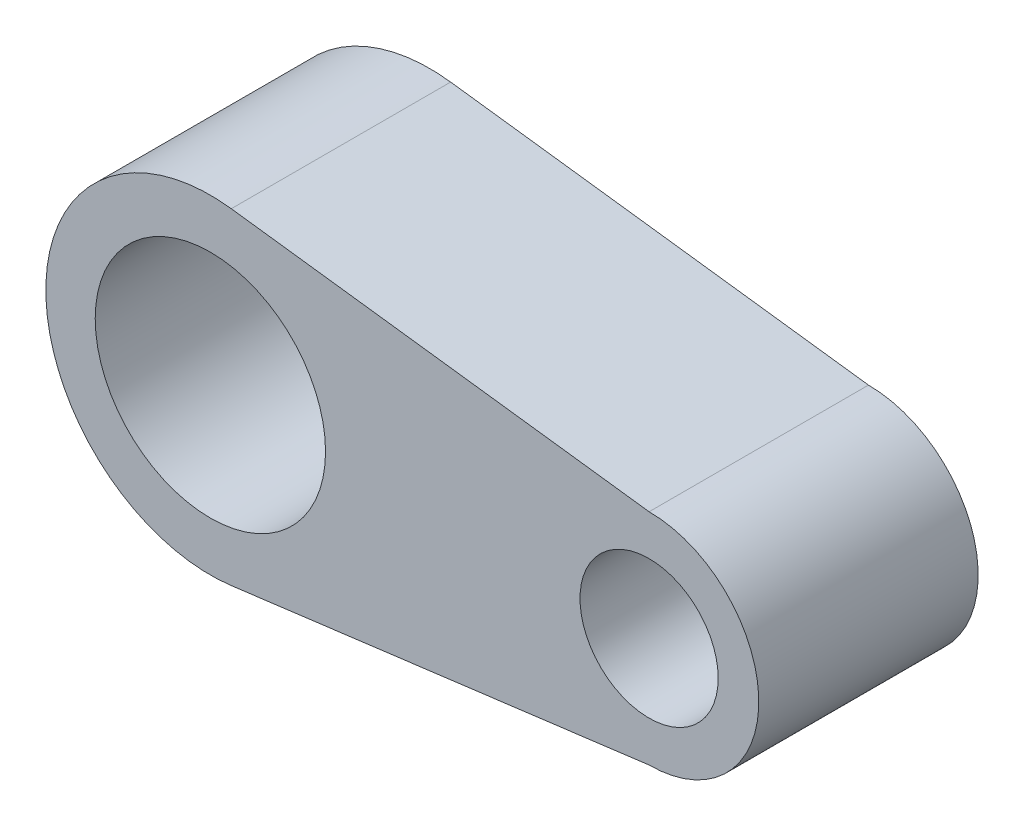
ISO-10303-21;
HEADER;
FILE_DESCRIPTION(('STEP AP214'),'2;1');
FILE_NAME('part.step','',(''),(''),'','','');
FILE_SCHEMA(('AUTOMOTIVE_DESIGN { 1 0 10303 214 1 1 1 1 }'));
ENDSEC;
DATA;
#1=APPLICATION_CONTEXT('core data for automotive mechanical design processes');
#2=APPLICATION_PROTOCOL_DEFINITION('international standard','automotive_design',2000,#1);
#3=PRODUCT_CONTEXT('',#1,'mechanical');
#4=PRODUCT('Part','Part','',(#3));
#5=PRODUCT_RELATED_PRODUCT_CATEGORY('part','',(#4));
#6=PRODUCT_DEFINITION_FORMATION('','',#4);
#7=PRODUCT_DEFINITION_CONTEXT('part definition',#1,'design');
#8=PRODUCT_DEFINITION('design','',#6,#7);
#9=PRODUCT_DEFINITION_SHAPE('','',#8);
#10=(LENGTH_UNIT() NAMED_UNIT(*) SI_UNIT(.MILLI.,.METRE.));
#11=(NAMED_UNIT(*) PLANE_ANGLE_UNIT() SI_UNIT($,.RADIAN.));
#12=(NAMED_UNIT(*) SI_UNIT($,.STERADIAN.) SOLID_ANGLE_UNIT());
#13=UNCERTAINTY_MEASURE_WITH_UNIT(LENGTH_MEASURE(1.E-05),#10,'distance_accuracy_value','');
#14=(GEOMETRIC_REPRESENTATION_CONTEXT(3) GLOBAL_UNCERTAINTY_ASSIGNED_CONTEXT((#13)) GLOBAL_UNIT_ASSIGNED_CONTEXT((#10,
#11,#12)) REPRESENTATION_CONTEXT('',''));
#15=CARTESIAN_POINT('',(0.,0.,0.));
#16=DIRECTION('',(0.,0.,1.));
#17=DIRECTION('',(1.,0.,0.));
#18=AXIS2_PLACEMENT_3D('',#15,#16,#17);
#19=CARTESIAN_POINT('',(0.952688437970163,-7.43924624811937,10.));
#20=DIRECTION('',(0.127025125062688,-0.991899499749248,0.));
#21=DIRECTION('',(0.991899499749248,0.127025125062688,0.));
#22=AXIS2_PLACEMENT_3D('',#19,#20,#21);
#23=PLANE('',#22);
#24=DIRECTION('',(-0.991899499749248,-0.127025125062688,0.));
#25=VECTOR('',#24,1.);
#26=CARTESIAN_POINT('',(0.952688437970163,-7.43924624811937,0.));
#27=LINE('',#26,#25);
#28=CARTESIAN_POINT('',(20.,-5.,0.));
#29=VERTEX_POINT('',#28);
#30=CARTESIAN_POINT('',(0.952688437970161,-7.43924624811936,0.));
#31=VERTEX_POINT('',#30);
#32=EDGE_CURVE('E107',#29,#31,#27,.T.);
#33=ORIENTED_EDGE('',*,*,#32,.F.);
#34=DIRECTION('',(0.,0.,-1.));
#35=VECTOR('',#34,1.);
#36=CARTESIAN_POINT('',(20.,-5.,10.));
#37=LINE('',#36,#35);
#38=CARTESIAN_POINT('',(20.,-5.,10.));
#39=VERTEX_POINT('',#38);
#40=EDGE_CURVE('E11',#39,#29,#37,.T.);
#41=ORIENTED_EDGE('',*,*,#40,.F.);
#42=DIRECTION('',(-0.991899499749248,-0.127025125062688,0.));
#43=VECTOR('',#42,1.);
#44=CARTESIAN_POINT('',(0.952688437970163,-7.43924624811937,10.));
#45=LINE('',#44,#43);
#46=CARTESIAN_POINT('',(0.952688437970161,-7.43924624811936,10.));
#47=VERTEX_POINT('',#46);
#48=EDGE_CURVE('E89',#39,#47,#45,.T.);
#49=ORIENTED_EDGE('',*,*,#48,.T.);
#50=DIRECTION('',(0.,0.,-1.));
#51=VECTOR('',#50,1.);
#52=CARTESIAN_POINT('',(0.952688437970161,-7.43924624811936,10.));
#53=LINE('',#52,#51);
#54=EDGE_CURVE('E77',#47,#31,#53,.T.);
#55=ORIENTED_EDGE('',*,*,#54,.T.);
#56=EDGE_LOOP('',(#33,#41,#49,#55));
#57=FACE_BOUND('',#56,.T.);
#58=ADVANCED_FACE('F38',(#57),#23,.T.);
#59=CARTESIAN_POINT('',(20.,0.,10.));
#60=DIRECTION('',(0.,0.,-1.));
#61=DIRECTION('',(-1.,0.,0.));
#62=AXIS2_PLACEMENT_3D('',#59,#60,#61);
#63=CYLINDRICAL_SURFACE('',#62,5.);
#64=CARTESIAN_POINT('',(20.,0.,0.));
#65=DIRECTION('',(0.,0.,1.));
#66=DIRECTION('',(1.,0.,0.));
#67=AXIS2_PLACEMENT_3D('',#64,#65,#66);
#68=CIRCLE('',#67,5.);
#69=CARTESIAN_POINT('',(20.,5.,0.));
#70=VERTEX_POINT('',#69);
#71=EDGE_CURVE('E94',#29,#70,#68,.T.);
#72=ORIENTED_EDGE('',*,*,#71,.T.);
#73=DIRECTION('',(0.,0.,-1.));
#74=VECTOR('',#73,1.);
#75=CARTESIAN_POINT('',(20.,5.,10.));
#76=LINE('',#75,#74);
#77=CARTESIAN_POINT('',(20.,5.,10.));
#78=VERTEX_POINT('',#77);
#79=EDGE_CURVE('E46',#78,#70,#76,.T.);
#80=ORIENTED_EDGE('',*,*,#79,.F.);
#81=CARTESIAN_POINT('',(20.,0.,10.));
#82=DIRECTION('',(0.,0.,1.));
#83=DIRECTION('',(1.,0.,0.));
#84=AXIS2_PLACEMENT_3D('',#81,#82,#83);
#85=CIRCLE('',#84,5.);
#86=EDGE_CURVE('E83',#39,#78,#85,.T.);
#87=ORIENTED_EDGE('',*,*,#86,.F.);
#88=ORIENTED_EDGE('',*,*,#40,.T.);
#89=EDGE_LOOP('',(#72,#80,#87,#88));
#90=FACE_BOUND('',#89,.T.);
#91=ADVANCED_FACE('F92',(#90),#63,.T.);
#92=CARTESIAN_POINT('',(0.952688437970159,7.43924624811936,10.));
#93=DIRECTION('',(-0.127025125062688,-0.991899499749248,0.));
#94=DIRECTION('',(0.991899499749248,-0.127025125062688,0.));
#95=AXIS2_PLACEMENT_3D('',#92,#93,#94);
#96=PLANE('',#95);
#97=DIRECTION('',(-0.991899499749248,0.127025125062688,0.));
#98=VECTOR('',#97,1.);
#99=CARTESIAN_POINT('',(0.952688437970159,7.43924624811936,0.));
#100=LINE('',#99,#98);
#101=CARTESIAN_POINT('',(0.952688437970159,7.43924624811936,0.));
#102=VERTEX_POINT('',#101);
#103=EDGE_CURVE('E70',#70,#102,#100,.T.);
#104=ORIENTED_EDGE('',*,*,#103,.T.);
#105=DIRECTION('',(0.,0.,-1.));
#106=VECTOR('',#105,1.);
#107=CARTESIAN_POINT('',(0.952688437970159,7.43924624811936,10.));
#108=LINE('',#107,#106);
#109=CARTESIAN_POINT('',(0.952688437970159,7.43924624811936,10.));
#110=VERTEX_POINT('',#109);
#111=EDGE_CURVE('E95',#110,#102,#108,.T.);
#112=ORIENTED_EDGE('',*,*,#111,.F.);
#113=DIRECTION('',(-0.991899499749248,0.127025125062688,0.));
#114=VECTOR('',#113,1.);
#115=CARTESIAN_POINT('',(0.952688437970159,7.43924624811936,10.));
#116=LINE('',#115,#114);
#117=EDGE_CURVE('E88',#78,#110,#116,.T.);
#118=ORIENTED_EDGE('',*,*,#117,.F.);
#119=ORIENTED_EDGE('',*,*,#79,.T.);
#120=EDGE_LOOP('',(#104,#112,#118,#119));
#121=FACE_BOUND('',#120,.T.);
#122=ADVANCED_FACE('F96',(#121),#96,.F.);
#123=CARTESIAN_POINT('',(0.,0.,10.));
#124=DIRECTION('',(0.,0.,-1.));
#125=DIRECTION('',(-1.,0.,0.));
#126=AXIS2_PLACEMENT_3D('',#123,#124,#125);
#127=CYLINDRICAL_SURFACE('',#126,5.25);
#128=CARTESIAN_POINT('',(0.,0.,10.));
#129=DIRECTION('',(0.,0.,1.));
#130=DIRECTION('',(1.,0.,0.));
#131=AXIS2_PLACEMENT_3D('',#128,#129,#130);
#132=CIRCLE('',#131,5.25);
#133=CARTESIAN_POINT('',(5.25,0.,10.));
#134=VERTEX_POINT('',#133);
#135=EDGE_CURVE('E98',#134,#134,#132,.T.);
#136=ORIENTED_EDGE('',*,*,#135,.T.);
#137=EDGE_LOOP('',(#136));
#138=FACE_BOUND('',#137,.T.);
#139=CARTESIAN_POINT('',(0.,0.,0.));
#140=DIRECTION('',(0.,0.,1.));
#141=DIRECTION('',(1.,0.,0.));
#142=AXIS2_PLACEMENT_3D('',#139,#140,#141);
#143=CIRCLE('',#142,5.25);
#144=CARTESIAN_POINT('',(5.25,0.,0.));
#145=VERTEX_POINT('',#144);
#146=EDGE_CURVE('E114',#145,#145,#143,.T.);
#147=ORIENTED_EDGE('',*,*,#146,.F.);
#148=EDGE_LOOP('',(#147));
#149=FACE_BOUND('',#148,.T.);
#150=ADVANCED_FACE('F134',(#138,#149),#127,.F.);
#151=CARTESIAN_POINT('',(0.,0.,10.));
#152=DIRECTION('',(0.,0.,-1.));
#153=DIRECTION('',(-1.,0.,0.));
#154=AXIS2_PLACEMENT_3D('',#151,#152,#153);
#155=CYLINDRICAL_SURFACE('',#154,7.5);
#156=CARTESIAN_POINT('',(0.,0.,0.));
#157=DIRECTION('',(0.,0.,1.));
#158=DIRECTION('',(1.,0.,0.));
#159=AXIS2_PLACEMENT_3D('',#156,#157,#158);
#160=CIRCLE('',#159,7.5);
#161=EDGE_CURVE('E112',#102,#31,#160,.T.);
#162=ORIENTED_EDGE('',*,*,#161,.T.);
#163=ORIENTED_EDGE('',*,*,#54,.F.);
#164=CARTESIAN_POINT('',(0.,0.,10.));
#165=DIRECTION('',(0.,0.,1.));
#166=DIRECTION('',(1.,0.,0.));
#167=AXIS2_PLACEMENT_3D('',#164,#165,#166);
#168=CIRCLE('',#167,7.5);
#169=EDGE_CURVE('E54',#110,#47,#168,.T.);
#170=ORIENTED_EDGE('',*,*,#169,.F.);
#171=ORIENTED_EDGE('',*,*,#111,.T.);
#172=EDGE_LOOP('',(#162,#163,#170,#171));
#173=FACE_BOUND('',#172,.T.);
#174=ADVANCED_FACE('F123',(#173),#155,.T.);
#175=CARTESIAN_POINT('',(20.,0.,10.));
#176=DIRECTION('',(0.,0.,-1.));
#177=DIRECTION('',(-1.,0.,0.));
#178=AXIS2_PLACEMENT_3D('',#175,#176,#177);
#179=CYLINDRICAL_SURFACE('',#178,3.15);
#180=CARTESIAN_POINT('',(20.,0.,10.));
#181=DIRECTION('',(0.,0.,1.));
#182=DIRECTION('',(1.,0.,0.));
#183=AXIS2_PLACEMENT_3D('',#180,#181,#182);
#184=CIRCLE('',#183,3.15);
#185=CARTESIAN_POINT('',(23.15,0.,10.));
#186=VERTEX_POINT('',#185);
#187=EDGE_CURVE('E104',#186,#186,#184,.T.);
#188=ORIENTED_EDGE('',*,*,#187,.T.);
#189=EDGE_LOOP('',(#188));
#190=FACE_BOUND('',#189,.T.);
#191=CARTESIAN_POINT('',(20.,0.,0.));
#192=DIRECTION('',(0.,0.,1.));
#193=DIRECTION('',(1.,0.,0.));
#194=AXIS2_PLACEMENT_3D('',#191,#192,#193);
#195=CIRCLE('',#194,3.15);
#196=CARTESIAN_POINT('',(23.15,0.,0.));
#197=VERTEX_POINT('',#196);
#198=EDGE_CURVE('E117',#197,#197,#195,.T.);
#199=ORIENTED_EDGE('',*,*,#198,.F.);
#200=EDGE_LOOP('',(#199));
#201=FACE_BOUND('',#200,.T.);
#202=ADVANCED_FACE('F139',(#190,#201),#179,.F.);
#203=CARTESIAN_POINT('',(0.,0.,10.));
#204=DIRECTION('',(0.,0.,1.));
#205=DIRECTION('',(1.,0.,0.));
#206=AXIS2_PLACEMENT_3D('',#203,#204,#205);
#207=PLANE('',#206);
#208=ORIENTED_EDGE('',*,*,#48,.F.);
#209=ORIENTED_EDGE('',*,*,#86,.T.);
#210=ORIENTED_EDGE('',*,*,#117,.T.);
#211=ORIENTED_EDGE('',*,*,#169,.T.);
#212=EDGE_LOOP('',(#208,#209,#210,#211));
#213=FACE_BOUND('',#212,.T.);
#214=ORIENTED_EDGE('',*,*,#135,.F.);
#215=EDGE_LOOP('',(#214));
#216=FACE_BOUND('',#215,.T.);
#217=ORIENTED_EDGE('',*,*,#187,.F.);
#218=EDGE_LOOP('',(#217));
#219=FACE_BOUND('',#218,.T.);
#220=ADVANCED_FACE('F85',(#213,#216,#219),#207,.T.);
#221=CARTESIAN_POINT('',(0.,0.,0.));
#222=DIRECTION('',(0.,0.,1.));
#223=DIRECTION('',(1.,0.,0.));
#224=AXIS2_PLACEMENT_3D('',#221,#222,#223);
#225=PLANE('',#224);
#226=ORIENTED_EDGE('',*,*,#32,.T.);
#227=ORIENTED_EDGE('',*,*,#161,.F.);
#228=ORIENTED_EDGE('',*,*,#103,.F.);
#229=ORIENTED_EDGE('',*,*,#71,.F.);
#230=EDGE_LOOP('',(#226,#227,#228,#229));
#231=FACE_BOUND('',#230,.T.);
#232=ORIENTED_EDGE('',*,*,#146,.T.);
#233=EDGE_LOOP('',(#232));
#234=FACE_BOUND('',#233,.T.);
#235=ORIENTED_EDGE('',*,*,#198,.T.);
#236=EDGE_LOOP('',(#235));
#237=FACE_BOUND('',#236,.T.);
#238=ADVANCED_FACE('F125',(#231,#234,#237),#225,.F.);
#239=CLOSED_SHELL('',(#58,#91,#122,#150,#174,#202,#220,#238));
#240=MANIFOLD_SOLID_BREP('B2',#239);
#241=ADVANCED_BREP_SHAPE_REPRESENTATION('',(#18,#240),#14);
#242=SHAPE_DEFINITION_REPRESENTATION(#9,#241);
ENDSEC;
END-ISO-10303-21;
